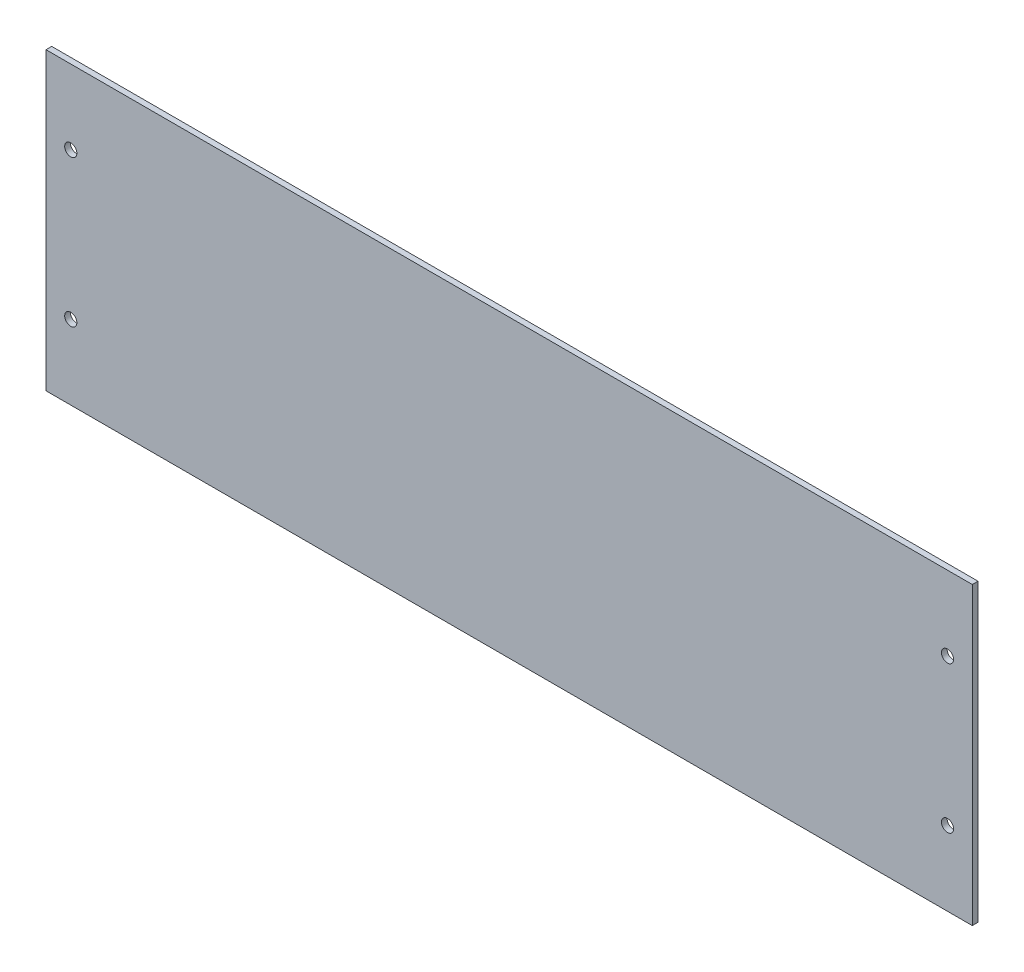
ISO-10303-21;
HEADER;
FILE_DESCRIPTION(('STEP AP214'),'2;1');
FILE_NAME('part.step','',(''),(''),'','','');
FILE_SCHEMA(('AUTOMOTIVE_DESIGN { 1 0 10303 214 1 1 1 1 }'));
ENDSEC;
DATA;
#1=APPLICATION_CONTEXT('core data for automotive mechanical design processes');
#2=APPLICATION_PROTOCOL_DEFINITION('international standard','automotive_design',2000,#1);
#3=PRODUCT_CONTEXT('',#1,'mechanical');
#4=PRODUCT('Part','Part','',(#3));
#5=PRODUCT_RELATED_PRODUCT_CATEGORY('part','',(#4));
#6=PRODUCT_DEFINITION_FORMATION('','',#4);
#7=PRODUCT_DEFINITION_CONTEXT('part definition',#1,'design');
#8=PRODUCT_DEFINITION('design','',#6,#7);
#9=PRODUCT_DEFINITION_SHAPE('','',#8);
#10=(LENGTH_UNIT() NAMED_UNIT(*) SI_UNIT(.MILLI.,.METRE.));
#11=(NAMED_UNIT(*) PLANE_ANGLE_UNIT() SI_UNIT($,.RADIAN.));
#12=(NAMED_UNIT(*) SI_UNIT($,.STERADIAN.) SOLID_ANGLE_UNIT());
#13=UNCERTAINTY_MEASURE_WITH_UNIT(LENGTH_MEASURE(1.E-05),#10,'distance_accuracy_value','');
#14=(GEOMETRIC_REPRESENTATION_CONTEXT(3) GLOBAL_UNCERTAINTY_ASSIGNED_CONTEXT((#13)) GLOBAL_UNIT_ASSIGNED_CONTEXT((#10,
#11,#12)) REPRESENTATION_CONTEXT('',''));
#15=CARTESIAN_POINT('',(0.,0.,0.));
#16=DIRECTION('',(0.,0.,1.));
#17=DIRECTION('',(1.,0.,0.));
#18=AXIS2_PLACEMENT_3D('',#15,#16,#17);
#19=CARTESIAN_POINT('',(0.,0.,1.5));
#20=DIRECTION('',(0.,0.,1.));
#21=DIRECTION('',(1.,0.,0.));
#22=AXIS2_PLACEMENT_3D('',#19,#20,#21);
#23=PLANE('',#22);
#24=CARTESIAN_POINT('',(168.469343531707,18.2743592846075,1.5));
#25=DIRECTION('',(0.,0.,1.));
#26=DIRECTION('',(-1.,0.,0.));
#27=AXIS2_PLACEMENT_3D('',#24,#25,#26);
#28=CIRCLE('',#27,1.60000000000002);
#29=CARTESIAN_POINT('',(166.869343531707,18.2743592846075,1.5));
#30=VERTEX_POINT('',#29);
#31=EDGE_CURVE('E120',#30,#30,#28,.T.);
#32=ORIENTED_EDGE('',*,*,#31,.F.);
#33=EDGE_LOOP('',(#32));
#34=FACE_BOUND('',#33,.T.);
#35=CARTESIAN_POINT('',(-61.530656468293,56.7743592846075,1.5));
#36=DIRECTION('',(0.,0.,1.));
#37=DIRECTION('',(1.,0.,0.));
#38=AXIS2_PLACEMENT_3D('',#35,#36,#37);
#39=CIRCLE('',#38,1.6);
#40=CARTESIAN_POINT('',(-59.930656468293,56.7743592846075,1.5));
#41=VERTEX_POINT('',#40);
#42=EDGE_CURVE('E99',#41,#41,#39,.T.);
#43=ORIENTED_EDGE('',*,*,#42,.F.);
#44=EDGE_LOOP('',(#43));
#45=FACE_BOUND('',#44,.T.);
#46=DIRECTION('',(0.,-1.,0.));
#47=VECTOR('',#46,1.);
#48=CARTESIAN_POINT('',(-68.030656468293,76.2743592846075,1.5));
#49=LINE('',#48,#47);
#50=CARTESIAN_POINT('',(-68.030656468293,76.2743592846075,1.5));
#51=VERTEX_POINT('',#50);
#52=CARTESIAN_POINT('',(-68.0306564682929,-1.22564071539249,1.5));
#53=VERTEX_POINT('',#52);
#54=EDGE_CURVE('E84',#51,#53,#49,.T.);
#55=ORIENTED_EDGE('',*,*,#54,.T.);
#56=DIRECTION('',(1.,0.,0.));
#57=VECTOR('',#56,1.);
#58=CARTESIAN_POINT('',(-68.0306564682929,-1.22564071539249,1.5));
#59=LINE('',#58,#57);
#60=CARTESIAN_POINT('',(174.969343531707,-1.22564071539249,1.5));
#61=VERTEX_POINT('',#60);
#62=EDGE_CURVE('E79',#53,#61,#59,.T.);
#63=ORIENTED_EDGE('',*,*,#62,.T.);
#64=DIRECTION('',(0.,1.,0.));
#65=VECTOR('',#64,1.);
#66=CARTESIAN_POINT('',(174.969343531707,76.2743592846075,1.5));
#67=LINE('',#66,#65);
#68=CARTESIAN_POINT('',(174.969343531707,76.2743592846075,1.5));
#69=VERTEX_POINT('',#68);
#70=EDGE_CURVE('E82',#61,#69,#67,.T.);
#71=ORIENTED_EDGE('',*,*,#70,.T.);
#72=DIRECTION('',(-1.,0.,0.));
#73=VECTOR('',#72,1.);
#74=CARTESIAN_POINT('',(-68.030656468293,76.2743592846075,1.5));
#75=LINE('',#74,#73);
#76=EDGE_CURVE('E49',#69,#51,#75,.T.);
#77=ORIENTED_EDGE('',*,*,#76,.T.);
#78=EDGE_LOOP('',(#55,#63,#71,#77));
#79=FACE_BOUND('',#78,.T.);
#80=CARTESIAN_POINT('',(-61.5306564682929,18.2743592846075,1.5));
#81=DIRECTION('',(0.,0.,1.));
#82=DIRECTION('',(1.,0.,0.));
#83=AXIS2_PLACEMENT_3D('',#80,#81,#82);
#84=CIRCLE('',#83,1.6);
#85=CARTESIAN_POINT('',(-59.930656468293,18.2743592846075,1.5));
#86=VERTEX_POINT('',#85);
#87=EDGE_CURVE('E114',#86,#86,#84,.T.);
#88=ORIENTED_EDGE('',*,*,#87,.F.);
#89=EDGE_LOOP('',(#88));
#90=FACE_BOUND('',#89,.T.);
#91=CARTESIAN_POINT('',(168.469343531707,56.7743592846075,1.5));
#92=DIRECTION('',(0.,0.,1.));
#93=DIRECTION('',(-1.,0.,0.));
#94=AXIS2_PLACEMENT_3D('',#91,#92,#93);
#95=CIRCLE('',#94,1.60000000000002);
#96=CARTESIAN_POINT('',(166.869343531707,56.7743592846075,1.5));
#97=VERTEX_POINT('',#96);
#98=EDGE_CURVE('E126',#97,#97,#95,.T.);
#99=ORIENTED_EDGE('',*,*,#98,.F.);
#100=EDGE_LOOP('',(#99));
#101=FACE_BOUND('',#100,.T.);
#102=ADVANCED_FACE('F32',(#34,#45,#79,#90,#101),#23,.T.);
#103=CARTESIAN_POINT('',(0.,0.,0.));
#104=DIRECTION('',(0.,0.,1.));
#105=DIRECTION('',(1.,0.,0.));
#106=AXIS2_PLACEMENT_3D('',#103,#104,#105);
#107=PLANE('',#106);
#108=CARTESIAN_POINT('',(168.469343531707,18.2743592846075,0.));
#109=DIRECTION('',(0.,0.,1.));
#110=DIRECTION('',(-1.,0.,0.));
#111=AXIS2_PLACEMENT_3D('',#108,#109,#110);
#112=CIRCLE('',#111,1.60000000000002);
#113=CARTESIAN_POINT('',(166.869343531707,18.2743592846075,0.));
#114=VERTEX_POINT('',#113);
#115=EDGE_CURVE('E123',#114,#114,#112,.T.);
#116=ORIENTED_EDGE('',*,*,#115,.T.);
#117=EDGE_LOOP('',(#116));
#118=FACE_BOUND('',#117,.T.);
#119=CARTESIAN_POINT('',(-61.530656468293,56.7743592846075,0.));
#120=DIRECTION('',(0.,0.,1.));
#121=DIRECTION('',(1.,0.,0.));
#122=AXIS2_PLACEMENT_3D('',#119,#120,#121);
#123=CIRCLE('',#122,1.6);
#124=CARTESIAN_POINT('',(-59.930656468293,56.7743592846075,0.));
#125=VERTEX_POINT('',#124);
#126=EDGE_CURVE('E111',#125,#125,#123,.T.);
#127=ORIENTED_EDGE('',*,*,#126,.T.);
#128=EDGE_LOOP('',(#127));
#129=FACE_BOUND('',#128,.T.);
#130=DIRECTION('',(0.,-1.,0.));
#131=VECTOR('',#130,1.);
#132=CARTESIAN_POINT('',(-68.030656468293,76.2743592846075,0.));
#133=LINE('',#132,#131);
#134=CARTESIAN_POINT('',(-68.030656468293,76.2743592846075,0.));
#135=VERTEX_POINT('',#134);
#136=CARTESIAN_POINT('',(-68.0306564682929,-1.22564071539249,0.));
#137=VERTEX_POINT('',#136);
#138=EDGE_CURVE('E96',#135,#137,#133,.T.);
#139=ORIENTED_EDGE('',*,*,#138,.F.);
#140=DIRECTION('',(-1.,0.,0.));
#141=VECTOR('',#140,1.);
#142=CARTESIAN_POINT('',(-68.030656468293,76.2743592846075,0.));
#143=LINE('',#142,#141);
#144=CARTESIAN_POINT('',(174.969343531707,76.2743592846075,0.));
#145=VERTEX_POINT('',#144);
#146=EDGE_CURVE('E72',#145,#135,#143,.T.);
#147=ORIENTED_EDGE('',*,*,#146,.F.);
#148=DIRECTION('',(0.,1.,0.));
#149=VECTOR('',#148,1.);
#150=CARTESIAN_POINT('',(174.969343531707,76.2743592846075,0.));
#151=LINE('',#150,#149);
#152=CARTESIAN_POINT('',(174.969343531707,-1.22564071539249,0.));
#153=VERTEX_POINT('',#152);
#154=EDGE_CURVE('E66',#153,#145,#151,.T.);
#155=ORIENTED_EDGE('',*,*,#154,.F.);
#156=DIRECTION('',(1.,0.,0.));
#157=VECTOR('',#156,1.);
#158=CARTESIAN_POINT('',(-68.0306564682929,-1.22564071539249,0.));
#159=LINE('',#158,#157);
#160=EDGE_CURVE('E88',#137,#153,#159,.T.);
#161=ORIENTED_EDGE('',*,*,#160,.F.);
#162=EDGE_LOOP('',(#139,#147,#155,#161));
#163=FACE_BOUND('',#162,.T.);
#164=CARTESIAN_POINT('',(-61.5306564682929,18.2743592846075,0.));
#165=DIRECTION('',(0.,0.,1.));
#166=DIRECTION('',(1.,0.,0.));
#167=AXIS2_PLACEMENT_3D('',#164,#165,#166);
#168=CIRCLE('',#167,1.6);
#169=CARTESIAN_POINT('',(-59.930656468293,18.2743592846075,0.));
#170=VERTEX_POINT('',#169);
#171=EDGE_CURVE('E117',#170,#170,#168,.T.);
#172=ORIENTED_EDGE('',*,*,#171,.T.);
#173=EDGE_LOOP('',(#172));
#174=FACE_BOUND('',#173,.T.);
#175=CARTESIAN_POINT('',(168.469343531707,56.7743592846075,0.));
#176=DIRECTION('',(0.,0.,1.));
#177=DIRECTION('',(-1.,0.,0.));
#178=AXIS2_PLACEMENT_3D('',#175,#176,#177);
#179=CIRCLE('',#178,1.60000000000002);
#180=CARTESIAN_POINT('',(166.869343531707,56.7743592846075,0.));
#181=VERTEX_POINT('',#180);
#182=EDGE_CURVE('E129',#181,#181,#179,.T.);
#183=ORIENTED_EDGE('',*,*,#182,.T.);
#184=EDGE_LOOP('',(#183));
#185=FACE_BOUND('',#184,.T.);
#186=ADVANCED_FACE('F107',(#118,#129,#163,#174,#185),#107,.F.);
#187=CARTESIAN_POINT('',(-68.030656468293,76.2743592846075,1.5));
#188=DIRECTION('',(1.,0.,0.));
#189=DIRECTION('',(0.,1.,0.));
#190=AXIS2_PLACEMENT_3D('',#187,#188,#189);
#191=PLANE('',#190);
#192=ORIENTED_EDGE('',*,*,#138,.T.);
#193=DIRECTION('',(0.,0.,-1.));
#194=VECTOR('',#193,1.);
#195=CARTESIAN_POINT('',(-68.0306564682929,-1.22564071539249,1.5));
#196=LINE('',#195,#194);
#197=EDGE_CURVE('E11',#53,#137,#196,.T.);
#198=ORIENTED_EDGE('',*,*,#197,.F.);
#199=ORIENTED_EDGE('',*,*,#54,.F.);
#200=DIRECTION('',(0.,0.,-1.));
#201=VECTOR('',#200,1.);
#202=CARTESIAN_POINT('',(-68.030656468293,76.2743592846075,1.5));
#203=LINE('',#202,#201);
#204=EDGE_CURVE('E92',#51,#135,#203,.T.);
#205=ORIENTED_EDGE('',*,*,#204,.T.);
#206=EDGE_LOOP('',(#192,#198,#199,#205));
#207=FACE_BOUND('',#206,.T.);
#208=ADVANCED_FACE('F34',(#207),#191,.F.);
#209=CARTESIAN_POINT('',(-68.0306564682929,-1.22564071539249,1.5));
#210=DIRECTION('',(0.,1.,0.));
#211=DIRECTION('',(0.,0.,1.));
#212=AXIS2_PLACEMENT_3D('',#209,#210,#211);
#213=PLANE('',#212);
#214=ORIENTED_EDGE('',*,*,#160,.T.);
#215=DIRECTION('',(0.,0.,-1.));
#216=VECTOR('',#215,1.);
#217=CARTESIAN_POINT('',(174.969343531707,-1.22564071539249,1.5));
#218=LINE('',#217,#216);
#219=EDGE_CURVE('E41',#61,#153,#218,.T.);
#220=ORIENTED_EDGE('',*,*,#219,.F.);
#221=ORIENTED_EDGE('',*,*,#62,.F.);
#222=ORIENTED_EDGE('',*,*,#197,.T.);
#223=EDGE_LOOP('',(#214,#220,#221,#222));
#224=FACE_BOUND('',#223,.T.);
#225=ADVANCED_FACE('F87',(#224),#213,.F.);
#226=CARTESIAN_POINT('',(174.969343531707,76.2743592846075,1.5));
#227=DIRECTION('',(-1.,0.,0.));
#228=DIRECTION('',(0.,0.,1.));
#229=AXIS2_PLACEMENT_3D('',#226,#227,#228);
#230=PLANE('',#229);
#231=ORIENTED_EDGE('',*,*,#154,.T.);
#232=DIRECTION('',(0.,0.,-1.));
#233=VECTOR('',#232,1.);
#234=CARTESIAN_POINT('',(174.969343531707,76.2743592846075,1.5));
#235=LINE('',#234,#233);
#236=EDGE_CURVE('E89',#69,#145,#235,.T.);
#237=ORIENTED_EDGE('',*,*,#236,.F.);
#238=ORIENTED_EDGE('',*,*,#70,.F.);
#239=ORIENTED_EDGE('',*,*,#219,.T.);
#240=EDGE_LOOP('',(#231,#237,#238,#239));
#241=FACE_BOUND('',#240,.T.);
#242=ADVANCED_FACE('F90',(#241),#230,.F.);
#243=CARTESIAN_POINT('',(-68.030656468293,76.2743592846075,1.5));
#244=DIRECTION('',(0.,-1.,0.));
#245=DIRECTION('',(0.,0.,-1.));
#246=AXIS2_PLACEMENT_3D('',#243,#244,#245);
#247=PLANE('',#246);
#248=ORIENTED_EDGE('',*,*,#146,.T.);
#249=ORIENTED_EDGE('',*,*,#204,.F.);
#250=ORIENTED_EDGE('',*,*,#76,.F.);
#251=ORIENTED_EDGE('',*,*,#236,.T.);
#252=EDGE_LOOP('',(#248,#249,#250,#251));
#253=FACE_BOUND('',#252,.T.);
#254=ADVANCED_FACE('F104',(#253),#247,.F.);
#255=CARTESIAN_POINT('',(-61.530656468293,56.7743592846075,1.5));
#256=DIRECTION('',(0.,0.,-1.));
#257=DIRECTION('',(-1.,0.,0.));
#258=AXIS2_PLACEMENT_3D('',#255,#256,#257);
#259=CYLINDRICAL_SURFACE('',#258,1.6);
#260=ORIENTED_EDGE('',*,*,#42,.T.);
#261=EDGE_LOOP('',(#260));
#262=FACE_BOUND('',#261,.T.);
#263=ORIENTED_EDGE('',*,*,#126,.F.);
#264=EDGE_LOOP('',(#263));
#265=FACE_BOUND('',#264,.T.);
#266=ADVANCED_FACE('F149',(#262,#265),#259,.F.);
#267=CARTESIAN_POINT('',(-61.5306564682929,18.2743592846075,1.5));
#268=DIRECTION('',(0.,0.,-1.));
#269=DIRECTION('',(-1.,0.,0.));
#270=AXIS2_PLACEMENT_3D('',#267,#268,#269);
#271=CYLINDRICAL_SURFACE('',#270,1.6);
#272=ORIENTED_EDGE('',*,*,#87,.T.);
#273=EDGE_LOOP('',(#272));
#274=FACE_BOUND('',#273,.T.);
#275=ORIENTED_EDGE('',*,*,#171,.F.);
#276=EDGE_LOOP('',(#275));
#277=FACE_BOUND('',#276,.T.);
#278=ADVANCED_FACE('F195',(#274,#277),#271,.F.);
#279=CARTESIAN_POINT('',(168.469343531707,18.2743592846075,1.5));
#280=DIRECTION('',(0.,0.,-1.));
#281=DIRECTION('',(-1.,0.,0.));
#282=AXIS2_PLACEMENT_3D('',#279,#280,#281);
#283=CYLINDRICAL_SURFACE('',#282,1.60000000000002);
#284=ORIENTED_EDGE('',*,*,#31,.T.);
#285=EDGE_LOOP('',(#284));
#286=FACE_BOUND('',#285,.T.);
#287=ORIENTED_EDGE('',*,*,#115,.F.);
#288=EDGE_LOOP('',(#287));
#289=FACE_BOUND('',#288,.T.);
#290=ADVANCED_FACE('F203',(#286,#289),#283,.F.);
#291=CARTESIAN_POINT('',(168.469343531707,56.7743592846075,1.5));
#292=DIRECTION('',(0.,0.,-1.));
#293=DIRECTION('',(-1.,0.,0.));
#294=AXIS2_PLACEMENT_3D('',#291,#292,#293);
#295=CYLINDRICAL_SURFACE('',#294,1.60000000000002);
#296=ORIENTED_EDGE('',*,*,#98,.T.);
#297=EDGE_LOOP('',(#296));
#298=FACE_BOUND('',#297,.T.);
#299=ORIENTED_EDGE('',*,*,#182,.F.);
#300=EDGE_LOOP('',(#299));
#301=FACE_BOUND('',#300,.T.);
#302=ADVANCED_FACE('F135',(#298,#301),#295,.F.);
#303=CLOSED_SHELL('',(#102,#186,#208,#225,#242,#254,#266,#278,#290,#302));
#304=MANIFOLD_SOLID_BREP('B2',#303);
#305=ADVANCED_BREP_SHAPE_REPRESENTATION('',(#18,#304),#14);
#306=SHAPE_DEFINITION_REPRESENTATION(#9,#305);
ENDSEC;
END-ISO-10303-21;
